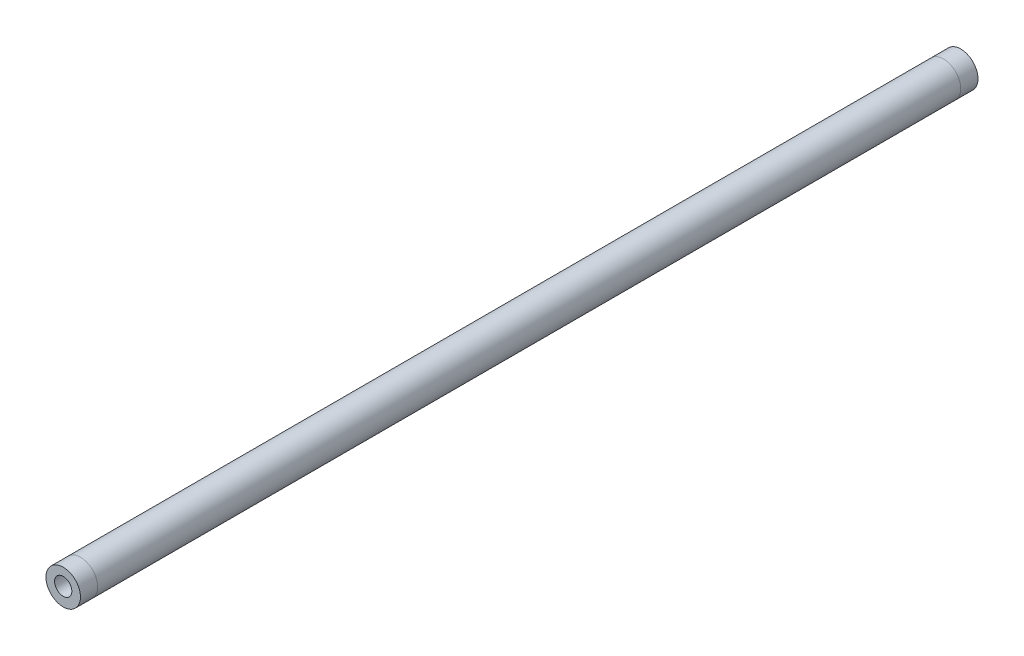
ISO-10303-21;
HEADER;
FILE_DESCRIPTION(('STEP AP214'),'2;1');
FILE_NAME('part.step','',(''),(''),'','','');
FILE_SCHEMA(('AUTOMOTIVE_DESIGN { 1 0 10303 214 1 1 1 1 }'));
ENDSEC;
DATA;
#1=APPLICATION_CONTEXT('core data for automotive mechanical design processes');
#2=APPLICATION_PROTOCOL_DEFINITION('international standard','automotive_design',2000,#1);
#3=PRODUCT_CONTEXT('',#1,'mechanical');
#4=PRODUCT('Part','Part','',(#3));
#5=PRODUCT_RELATED_PRODUCT_CATEGORY('part','',(#4));
#6=PRODUCT_DEFINITION_FORMATION('','',#4);
#7=PRODUCT_DEFINITION_CONTEXT('part definition',#1,'design');
#8=PRODUCT_DEFINITION('design','',#6,#7);
#9=PRODUCT_DEFINITION_SHAPE('','',#8);
#10=(LENGTH_UNIT() NAMED_UNIT(*) SI_UNIT(.MILLI.,.METRE.));
#11=(NAMED_UNIT(*) PLANE_ANGLE_UNIT() SI_UNIT($,.RADIAN.));
#12=(NAMED_UNIT(*) SI_UNIT($,.STERADIAN.) SOLID_ANGLE_UNIT());
#13=UNCERTAINTY_MEASURE_WITH_UNIT(LENGTH_MEASURE(1.E-05),#10,'distance_accuracy_value','');
#14=(GEOMETRIC_REPRESENTATION_CONTEXT(3) GLOBAL_UNCERTAINTY_ASSIGNED_CONTEXT((#13)) GLOBAL_UNIT_ASSIGNED_CONTEXT((#10,
#11,#12)) REPRESENTATION_CONTEXT('',''));
#15=CARTESIAN_POINT('',(0.,0.,0.));
#16=DIRECTION('',(0.,0.,1.));
#17=DIRECTION('',(1.,0.,0.));
#18=AXIS2_PLACEMENT_3D('',#15,#16,#17);
#19=CARTESIAN_POINT('',(0.,0.,-363.897823856573));
#20=DIRECTION('',(0.,0.,1.));
#21=DIRECTION('',(1.,0.,0.));
#22=AXIS2_PLACEMENT_3D('',#19,#20,#21);
#23=CYLINDRICAL_SURFACE('',#22,6.35);
#24=CARTESIAN_POINT('',(0.,0.,-345.937311614435));
#25=DIRECTION('',(0.,0.,1.));
#26=DIRECTION('',(1.,0.,0.));
#27=AXIS2_PLACEMENT_3D('',#24,#25,#26);
#28=CIRCLE('',#27,6.35);
#29=CARTESIAN_POINT('',(6.35,0.,-345.937311614435));
#30=VERTEX_POINT('',#29);
#31=EDGE_CURVE('E12',#30,#30,#28,.F.);
#32=ORIENTED_EDGE('',*,*,#31,.F.);
#33=EDGE_LOOP('',(#32));
#34=FACE_BOUND('',#33,.T.);
#35=CARTESIAN_POINT('',(0.,0.,-28.2448));
#36=DIRECTION('',(0.,0.,1.));
#37=DIRECTION('',(1.,0.,0.));
#38=AXIS2_PLACEMENT_3D('',#35,#36,#37);
#39=CIRCLE('',#38,6.35);
#40=CARTESIAN_POINT('',(6.35,0.,-28.2448));
#41=VERTEX_POINT('',#40);
#42=EDGE_CURVE('E79',#41,#41,#39,.T.);
#43=ORIENTED_EDGE('',*,*,#42,.F.);
#44=EDGE_LOOP('',(#43));
#45=FACE_BOUND('',#44,.T.);
#46=ADVANCED_FACE('F68',(#34,#45),#23,.T.);
#47=CARTESIAN_POINT('',(0.,0.,-28.2448));
#48=DIRECTION('',(0.,0.,1.));
#49=DIRECTION('',(1.,0.,0.));
#50=AXIS2_PLACEMENT_3D('',#47,#48,#49);
#51=PLANE('',#50);
#52=CARTESIAN_POINT('',(0.,0.,-28.2448));
#53=DIRECTION('',(0.,0.,1.));
#54=DIRECTION('',(1.,0.,0.));
#55=AXIS2_PLACEMENT_3D('',#52,#53,#54);
#56=CIRCLE('',#55,4.7625);
#57=CARTESIAN_POINT('',(4.7625,0.,-28.2448));
#58=VERTEX_POINT('',#57);
#59=EDGE_CURVE('E81',#58,#58,#56,.T.);
#60=ORIENTED_EDGE('',*,*,#59,.F.);
#61=EDGE_LOOP('',(#60));
#62=FACE_BOUND('',#61,.T.);
#63=ORIENTED_EDGE('',*,*,#42,.T.);
#64=EDGE_LOOP('',(#63));
#65=FACE_BOUND('',#64,.T.);
#66=ADVANCED_FACE('F86',(#62,#65),#51,.T.);
#67=CARTESIAN_POINT('',(0.,0.,-363.897823856573));
#68=DIRECTION('',(0.,0.,1.));
#69=DIRECTION('',(1.,0.,0.));
#70=AXIS2_PLACEMENT_3D('',#67,#68,#69);
#71=CYLINDRICAL_SURFACE('',#70,4.7625);
#72=CARTESIAN_POINT('',(0.,0.,-345.937311614435));
#73=DIRECTION('',(0.,0.,1.));
#74=DIRECTION('',(1.,0.,0.));
#75=AXIS2_PLACEMENT_3D('',#72,#73,#74);
#76=CIRCLE('',#75,4.7625);
#77=CARTESIAN_POINT('',(4.7625,0.,-345.937311614435));
#78=VERTEX_POINT('',#77);
#79=EDGE_CURVE('E71',#78,#78,#76,.F.);
#80=ORIENTED_EDGE('',*,*,#79,.T.);
#81=EDGE_LOOP('',(#80));
#82=FACE_BOUND('',#81,.T.);
#83=ORIENTED_EDGE('',*,*,#59,.T.);
#84=EDGE_LOOP('',(#83));
#85=FACE_BOUND('',#84,.T.);
#86=ADVANCED_FACE('F93',(#82,#85),#71,.F.);
#87=CARTESIAN_POINT('',(0.,0.,-345.937311614435));
#88=DIRECTION('',(0.,0.,1.));
#89=DIRECTION('',(1.,0.,0.));
#90=AXIS2_PLACEMENT_3D('',#87,#88,#89);
#91=PLANE('',#90);
#92=ORIENTED_EDGE('',*,*,#31,.T.);
#93=EDGE_LOOP('',(#92));
#94=FACE_BOUND('',#93,.T.);
#95=ORIENTED_EDGE('',*,*,#79,.F.);
#96=EDGE_LOOP('',(#95));
#97=FACE_BOUND('',#96,.T.);
#98=ADVANCED_FACE('F98',(#94,#97),#91,.F.);
#99=CLOSED_SHELL('',(#46,#66,#86,#98));
#100=MANIFOLD_SOLID_BREP('B2',#99);
#101=CARTESIAN_POINT('',(0.,0.,-345.937311614435));
#102=DIRECTION('',(0.,0.,1.));
#103=DIRECTION('',(1.,0.,0.));
#104=AXIS2_PLACEMENT_3D('',#101,#102,#103);
#105=PLANE('',#104);
#106=CARTESIAN_POINT('',(0.,0.,-345.937311614435));
#107=DIRECTION('',(0.,0.,1.));
#108=DIRECTION('',(1.,0.,0.));
#109=AXIS2_PLACEMENT_3D('',#106,#107,#108);
#110=CIRCLE('',#109,6.35);
#111=CARTESIAN_POINT('',(6.35,0.,-345.937311614435));
#112=VERTEX_POINT('',#111);
#113=EDGE_CURVE('E67',#112,#112,#110,.T.);
#114=ORIENTED_EDGE('',*,*,#113,.T.);
#115=EDGE_LOOP('',(#114));
#116=FACE_BOUND('',#115,.T.);
#117=CARTESIAN_POINT('',(0.,0.,-345.937311614435));
#118=DIRECTION('',(0.,0.,1.));
#119=DIRECTION('',(1.,0.,0.));
#120=AXIS2_PLACEMENT_3D('',#117,#118,#119);
#121=CIRCLE('',#120,4.7625);
#122=CARTESIAN_POINT('',(-4.7625,0.,-345.937311614435));
#123=VERTEX_POINT('',#122);
#124=EDGE_CURVE('E151',#123,#123,#121,.T.);
#125=ORIENTED_EDGE('',*,*,#124,.F.);
#126=EDGE_LOOP('',(#125));
#127=FACE_BOUND('',#126,.T.);
#128=ADVANCED_FACE('F137',(#116,#127),#105,.T.);
#129=CARTESIAN_POINT('',(0.,0.,-345.937311614435));
#130=DIRECTION('',(0.,0.,-1.));
#131=DIRECTION('',(-1.,0.,0.));
#132=AXIS2_PLACEMENT_3D('',#129,#130,#131);
#133=CYLINDRICAL_SURFACE('',#132,6.35);
#134=ORIENTED_EDGE('',*,*,#113,.F.);
#135=EDGE_LOOP('',(#134));
#136=FACE_BOUND('',#135,.T.);
#137=CARTESIAN_POINT('',(0.,0.,-352.287311614435));
#138=DIRECTION('',(0.,0.,1.));
#139=DIRECTION('',(1.,0.,0.));
#140=AXIS2_PLACEMENT_3D('',#137,#138,#139);
#141=CIRCLE('',#140,6.35);
#142=CARTESIAN_POINT('',(6.35,0.,-352.287311614435));
#143=VERTEX_POINT('',#142);
#144=EDGE_CURVE('E149',#143,#143,#141,.T.);
#145=ORIENTED_EDGE('',*,*,#144,.T.);
#146=EDGE_LOOP('',(#145));
#147=FACE_BOUND('',#146,.T.);
#148=ADVANCED_FACE('F139',(#136,#147),#133,.T.);
#149=CARTESIAN_POINT('',(0.,0.235008438761634,-345.937311614435));
#150=DIRECTION('',(0.,0.,-1.));
#151=DIRECTION('',(-1.,0.,0.));
#152=AXIS2_PLACEMENT_3D('',#149,#150,#151);
#153=CYLINDRICAL_SURFACE('',#152,3.175);
#154=CARTESIAN_POINT('',(0.,0.235008438761634,-352.287311614435));
#155=DIRECTION('',(0.,0.,1.));
#156=DIRECTION('',(1.,0.,0.));
#157=AXIS2_PLACEMENT_3D('',#154,#155,#156);
#158=CIRCLE('',#157,3.175);
#159=CARTESIAN_POINT('',(3.175,0.235008438761634,-352.287311614435));
#160=VERTEX_POINT('',#159);
#161=EDGE_CURVE('E141',#160,#160,#158,.T.);
#162=ORIENTED_EDGE('',*,*,#161,.F.);
#163=EDGE_LOOP('',(#162));
#164=FACE_BOUND('',#163,.T.);
#165=CARTESIAN_POINT('',(0.,0.235008438761634,-336.412311614435));
#166=DIRECTION('',(0.,0.,1.));
#167=DIRECTION('',(1.,0.,0.));
#168=AXIS2_PLACEMENT_3D('',#165,#166,#167);
#169=CIRCLE('',#168,3.175);
#170=CARTESIAN_POINT('',(3.175,0.235008438761634,-336.412311614435));
#171=VERTEX_POINT('',#170);
#172=EDGE_CURVE('E161',#171,#171,#169,.T.);
#173=ORIENTED_EDGE('',*,*,#172,.T.);
#174=EDGE_LOOP('',(#173));
#175=FACE_BOUND('',#174,.T.);
#176=ADVANCED_FACE('F166',(#164,#175),#153,.F.);
#177=CARTESIAN_POINT('',(0.,0.,-352.287311614435));
#178=DIRECTION('',(0.,0.,1.));
#179=DIRECTION('',(1.,0.,0.));
#180=AXIS2_PLACEMENT_3D('',#177,#178,#179);
#181=PLANE('',#180);
#182=ORIENTED_EDGE('',*,*,#144,.F.);
#183=EDGE_LOOP('',(#182));
#184=FACE_BOUND('',#183,.T.);
#185=ORIENTED_EDGE('',*,*,#161,.T.);
#186=EDGE_LOOP('',(#185));
#187=FACE_BOUND('',#186,.T.);
#188=ADVANCED_FACE('F171',(#184,#187),#181,.F.);
#189=CARTESIAN_POINT('',(0.,0.,-336.412311614435));
#190=DIRECTION('',(0.,0.,1.));
#191=DIRECTION('',(1.,0.,0.));
#192=AXIS2_PLACEMENT_3D('',#189,#190,#191);
#193=PLANE('',#192);
#194=CARTESIAN_POINT('',(0.,0.,-336.412311614435));
#195=DIRECTION('',(0.,0.,1.));
#196=DIRECTION('',(1.,0.,0.));
#197=AXIS2_PLACEMENT_3D('',#194,#195,#196);
#198=CIRCLE('',#197,4.7625);
#199=CARTESIAN_POINT('',(-4.7625,0.,-336.412311614435));
#200=VERTEX_POINT('',#199);
#201=EDGE_CURVE('E154',#200,#200,#198,.T.);
#202=ORIENTED_EDGE('',*,*,#201,.T.);
#203=EDGE_LOOP('',(#202));
#204=FACE_BOUND('',#203,.T.);
#205=ORIENTED_EDGE('',*,*,#172,.F.);
#206=EDGE_LOOP('',(#205));
#207=FACE_BOUND('',#206,.T.);
#208=ADVANCED_FACE('F168',(#204,#207),#193,.T.);
#209=CARTESIAN_POINT('',(0.,0.,-336.412311614435));
#210=DIRECTION('',(0.,0.,-1.));
#211=DIRECTION('',(-1.,0.,0.));
#212=AXIS2_PLACEMENT_3D('',#209,#210,#211);
#213=CYLINDRICAL_SURFACE('',#212,4.7625);
#214=CARTESIAN_POINT('',(-4.7625,0.,-336.412311614435));
#215=CARTESIAN_POINT('',(-4.7625,0.,-336.511530364435));
#216=CARTESIAN_POINT('',(-4.7625,0.,-336.610749114435));
#217=CARTESIAN_POINT('',(-4.7625,0.,-336.809186614435));
#218=CARTESIAN_POINT('',(-4.7625,0.,-336.908405364435));
#219=CARTESIAN_POINT('',(-4.7625,0.,-337.106842864435));
#220=CARTESIAN_POINT('',(-4.7625,0.,-337.206061614435));
#221=CARTESIAN_POINT('',(-4.7625,0.,-337.404499114435));
#222=CARTESIAN_POINT('',(-4.7625,0.,-337.503717864435));
#223=CARTESIAN_POINT('',(-4.7625,0.,-337.702155364435));
#224=CARTESIAN_POINT('',(-4.7625,0.,-337.801374114435));
#225=CARTESIAN_POINT('',(-4.7625,0.,-337.999811614435));
#226=CARTESIAN_POINT('',(-4.7625,0.,-338.099030364435));
#227=CARTESIAN_POINT('',(-4.7625,0.,-338.297467864435));
#228=CARTESIAN_POINT('',(-4.7625,0.,-338.396686614435));
#229=CARTESIAN_POINT('',(-4.7625,0.,-338.595124114435));
#230=CARTESIAN_POINT('',(-4.7625,0.,-338.694342864435));
#231=CARTESIAN_POINT('',(-4.7625,0.,-338.892780364435));
#232=CARTESIAN_POINT('',(-4.7625,0.,-338.991999114435));
#233=CARTESIAN_POINT('',(-4.7625,0.,-339.190436614435));
#234=CARTESIAN_POINT('',(-4.7625,0.,-339.289655364435));
#235=CARTESIAN_POINT('',(-4.7625,0.,-339.488092864435));
#236=CARTESIAN_POINT('',(-4.7625,0.,-339.587311614435));
#237=CARTESIAN_POINT('',(-4.7625,0.,-339.785749114435));
#238=CARTESIAN_POINT('',(-4.7625,0.,-339.884967864435));
#239=CARTESIAN_POINT('',(-4.7625,0.,-340.083405364435));
#240=CARTESIAN_POINT('',(-4.7625,0.,-340.182624114435));
#241=CARTESIAN_POINT('',(-4.7625,0.,-340.381061614435));
#242=CARTESIAN_POINT('',(-4.7625,0.,-340.480280364435));
#243=CARTESIAN_POINT('',(-4.7625,0.,-340.678717864435));
#244=CARTESIAN_POINT('',(-4.7625,0.,-340.777936614435));
#245=CARTESIAN_POINT('',(-4.7625,0.,-340.976374114435));
#246=CARTESIAN_POINT('',(-4.7625,0.,-341.075592864435));
#247=CARTESIAN_POINT('',(-4.7625,0.,-341.274030364435));
#248=CARTESIAN_POINT('',(-4.7625,0.,-341.373249114435));
#249=CARTESIAN_POINT('',(-4.7625,0.,-341.571686614435));
#250=CARTESIAN_POINT('',(-4.7625,0.,-341.670905364435));
#251=CARTESIAN_POINT('',(-4.7625,0.,-341.869342864435));
#252=CARTESIAN_POINT('',(-4.7625,0.,-341.968561614435));
#253=CARTESIAN_POINT('',(-4.7625,0.,-342.166999114435));
#254=CARTESIAN_POINT('',(-4.7625,0.,-342.266217864435));
#255=CARTESIAN_POINT('',(-4.7625,0.,-342.464655364435));
#256=CARTESIAN_POINT('',(-4.7625,0.,-342.563874114435));
#257=CARTESIAN_POINT('',(-4.7625,0.,-342.762311614435));
#258=CARTESIAN_POINT('',(-4.7625,0.,-342.861530364435));
#259=CARTESIAN_POINT('',(-4.7625,0.,-343.059967864435));
#260=CARTESIAN_POINT('',(-4.7625,0.,-343.159186614435));
#261=CARTESIAN_POINT('',(-4.7625,0.,-343.357624114435));
#262=CARTESIAN_POINT('',(-4.7625,0.,-343.456842864435));
#263=CARTESIAN_POINT('',(-4.7625,0.,-343.655280364435));
#264=CARTESIAN_POINT('',(-4.7625,0.,-343.754499114435));
#265=CARTESIAN_POINT('',(-4.7625,0.,-343.952936614435));
#266=CARTESIAN_POINT('',(-4.7625,0.,-344.052155364435));
#267=CARTESIAN_POINT('',(-4.7625,0.,-344.250592864435));
#268=CARTESIAN_POINT('',(-4.7625,0.,-344.349811614435));
#269=CARTESIAN_POINT('',(-4.7625,0.,-344.548249114435));
#270=CARTESIAN_POINT('',(-4.7625,0.,-344.647467864435));
#271=CARTESIAN_POINT('',(-4.7625,0.,-344.845905364435));
#272=CARTESIAN_POINT('',(-4.7625,0.,-344.945124114435));
#273=CARTESIAN_POINT('',(-4.7625,0.,-345.143561614435));
#274=CARTESIAN_POINT('',(-4.7625,0.,-345.242780364435));
#275=CARTESIAN_POINT('',(-4.7625,0.,-345.441217864435));
#276=CARTESIAN_POINT('',(-4.7625,0.,-345.540436614435));
#277=CARTESIAN_POINT('',(-4.7625,0.,-345.738874114435));
#278=CARTESIAN_POINT('',(-4.7625,0.,-345.838092864435));
#279=CARTESIAN_POINT('',(-4.7625,0.,-345.937311614435));
#280=B_SPLINE_CURVE_WITH_KNOTS('',3,(#214,#215,#216,#217,#218,#219,#220,#221,#222,#223,#224,
#225,#226,#227,#228,#229,#230,#231,#232,#233,#234,#235,#236,#237,#238,#239,#240,#241,#242,#243,
#244,#245,#246,#247,#248,#249,#250,#251,#252,#253,#254,#255,#256,#257,#258,#259,#260,#261,#262,
#263,#264,#265,#266,#267,#268,#269,#270,#271,#272,#273,#274,#275,#276,#277,#278,#279),
.UNSPECIFIED.,.F.,.F.,(4,2,2,2,2,2,2,2,2,2,2,2,2,2,2,2,2,2,2,2,2,2,2,2,2,2,2,2,2,2,2,2,4),(0.,
0.29765625,0.5953125,0.892968750000001,1.190625,1.48828125,1.7859375,2.08359375,2.38125,
2.67890625,2.9765625,3.27421875,3.571875,3.86953125,4.1671875,4.46484375,4.7625,5.06015625,
5.3578125,5.65546875,5.953125,6.25078125,6.5484375,6.84609375,7.14375,7.44140625,7.7390625,
8.03671875000001,8.334375,8.63203125,8.92968750000001,9.22734375000001,9.52500000000001),.UNSPECIFIED.);
#281=EDGE_CURVE('BSEAM170',#200,#123,#280,.T.);
#282=ORIENTED_EDGE('',*,*,#201,.F.);
#283=ORIENTED_EDGE('',*,*,#124,.T.);
#284=ORIENTED_EDGE('',*,*,#281,.T.);
#285=ORIENTED_EDGE('',*,*,#281,.F.);
#286=EDGE_LOOP('',(#282,#284,#283,#285));
#287=FACE_BOUND('',#286,.T.);
#288=ADVANCED_FACE('F170',(#287),#213,.T.);
#289=CLOSED_SHELL('',(#128,#148,#176,#188,#208,#288));
#290=MANIFOLD_SOLID_BREP('B7',#289);
#291=CARTESIAN_POINT('',(0.,0.,-28.2448));
#292=DIRECTION('',(0.,0.,1.));
#293=DIRECTION('',(1.,0.,0.));
#294=AXIS2_PLACEMENT_3D('',#291,#292,#293);
#295=CYLINDRICAL_SURFACE('',#294,6.35);
#296=CARTESIAN_POINT('',(0.,0.,-28.2448));
#297=DIRECTION('',(0.,0.,1.));
#298=DIRECTION('',(1.,0.,0.));
#299=AXIS2_PLACEMENT_3D('',#296,#297,#298);
#300=CIRCLE('',#299,6.35);
#301=CARTESIAN_POINT('',(6.35,0.,-28.2448));
#302=VERTEX_POINT('',#301);
#303=EDGE_CURVE('E136',#302,#302,#300,.T.);
#304=ORIENTED_EDGE('',*,*,#303,.T.);
#305=EDGE_LOOP('',(#304));
#306=FACE_BOUND('',#305,.T.);
#307=CARTESIAN_POINT('',(0.,0.,-21.8948));
#308=DIRECTION('',(0.,0.,1.));
#309=DIRECTION('',(1.,0.,0.));
#310=AXIS2_PLACEMENT_3D('',#307,#308,#309);
#311=CIRCLE('',#310,6.35);
#312=CARTESIAN_POINT('',(6.35,0.,-21.8948));
#313=VERTEX_POINT('',#312);
#314=EDGE_CURVE('E249',#313,#313,#311,.T.);
#315=ORIENTED_EDGE('',*,*,#314,.F.);
#316=EDGE_LOOP('',(#315));
#317=FACE_BOUND('',#316,.T.);
#318=ADVANCED_FACE('F238',(#306,#317),#295,.T.);
#319=CARTESIAN_POINT('',(0.,0.235008438761634,-28.2448));
#320=DIRECTION('',(0.,0.,1.));
#321=DIRECTION('',(1.,0.,0.));
#322=AXIS2_PLACEMENT_3D('',#319,#320,#321);
#323=CYLINDRICAL_SURFACE('',#322,3.175);
#324=CARTESIAN_POINT('',(0.,0.235008438761634,-21.8948));
#325=DIRECTION('',(0.,0.,1.));
#326=DIRECTION('',(1.,0.,0.));
#327=AXIS2_PLACEMENT_3D('',#324,#325,#326);
#328=CIRCLE('',#327,3.175);
#329=CARTESIAN_POINT('',(3.175,0.235008438761634,-21.8948));
#330=VERTEX_POINT('',#329);
#331=EDGE_CURVE('E241',#330,#330,#328,.T.);
#332=ORIENTED_EDGE('',*,*,#331,.T.);
#333=EDGE_LOOP('',(#332));
#334=FACE_BOUND('',#333,.T.);
#335=CARTESIAN_POINT('',(0.,0.235008438761634,-37.7698));
#336=DIRECTION('',(0.,0.,1.));
#337=DIRECTION('',(1.,0.,0.));
#338=AXIS2_PLACEMENT_3D('',#335,#336,#337);
#339=CIRCLE('',#338,3.175);
#340=CARTESIAN_POINT('',(3.175,0.235008438761634,-37.7698));
#341=VERTEX_POINT('',#340);
#342=EDGE_CURVE('E261',#341,#341,#339,.T.);
#343=ORIENTED_EDGE('',*,*,#342,.F.);
#344=EDGE_LOOP('',(#343));
#345=FACE_BOUND('',#344,.T.);
#346=ADVANCED_FACE('F269',(#334,#345),#323,.F.);
#347=CARTESIAN_POINT('',(0.,0.,-28.2448));
#348=DIRECTION('',(0.,0.,1.));
#349=DIRECTION('',(1.,0.,0.));
#350=AXIS2_PLACEMENT_3D('',#347,#348,#349);
#351=PLANE('',#350);
#352=CARTESIAN_POINT('',(0.,0.,-28.2448));
#353=DIRECTION('',(0.,0.,1.));
#354=DIRECTION('',(1.,0.,0.));
#355=AXIS2_PLACEMENT_3D('',#352,#353,#354);
#356=CIRCLE('',#355,4.7625);
#357=CARTESIAN_POINT('',(4.7625,0.,-28.2448));
#358=VERTEX_POINT('',#357);
#359=EDGE_CURVE('E251',#358,#358,#356,.T.);
#360=ORIENTED_EDGE('',*,*,#359,.T.);
#361=EDGE_LOOP('',(#360));
#362=FACE_BOUND('',#361,.T.);
#363=ORIENTED_EDGE('',*,*,#303,.F.);
#364=EDGE_LOOP('',(#363));
#365=FACE_BOUND('',#364,.T.);
#366=ADVANCED_FACE('F271',(#362,#365),#351,.F.);
#367=CARTESIAN_POINT('',(0.,0.,-21.8948));
#368=DIRECTION('',(0.,0.,1.));
#369=DIRECTION('',(1.,0.,0.));
#370=AXIS2_PLACEMENT_3D('',#367,#368,#369);
#371=PLANE('',#370);
#372=ORIENTED_EDGE('',*,*,#314,.T.);
#373=EDGE_LOOP('',(#372));
#374=FACE_BOUND('',#373,.T.);
#375=ORIENTED_EDGE('',*,*,#331,.F.);
#376=EDGE_LOOP('',(#375));
#377=FACE_BOUND('',#376,.T.);
#378=ADVANCED_FACE('F277',(#374,#377),#371,.T.);
#379=CARTESIAN_POINT('',(0.,0.,-37.7698));
#380=DIRECTION('',(0.,0.,1.));
#381=DIRECTION('',(1.,0.,0.));
#382=AXIS2_PLACEMENT_3D('',#379,#380,#381);
#383=CYLINDRICAL_SURFACE('',#382,4.7625);
#384=CARTESIAN_POINT('',(0.,0.,-37.7698));
#385=DIRECTION('',(0.,0.,1.));
#386=DIRECTION('',(1.,0.,0.));
#387=AXIS2_PLACEMENT_3D('',#384,#385,#386);
#388=CIRCLE('',#387,4.7625);
#389=CARTESIAN_POINT('',(4.7625,0.,-37.7698));
#390=VERTEX_POINT('',#389);
#391=EDGE_CURVE('E254',#390,#390,#388,.T.);
#392=CARTESIAN_POINT('',(4.7625,0.,-37.7698));
#393=CARTESIAN_POINT('',(4.7625,0.,-37.67058125));
#394=CARTESIAN_POINT('',(4.7625,0.,-37.5713625));
#395=CARTESIAN_POINT('',(4.7625,0.,-37.372925));
#396=CARTESIAN_POINT('',(4.7625,0.,-37.27370625));
#397=CARTESIAN_POINT('',(4.7625,0.,-37.07526875));
#398=CARTESIAN_POINT('',(4.7625,0.,-36.97605));
#399=CARTESIAN_POINT('',(4.7625,0.,-36.7776125));
#400=CARTESIAN_POINT('',(4.7625,0.,-36.67839375));
#401=CARTESIAN_POINT('',(4.7625,0.,-36.47995625));
#402=CARTESIAN_POINT('',(4.7625,0.,-36.3807375));
#403=CARTESIAN_POINT('',(4.7625,0.,-36.1823));
#404=CARTESIAN_POINT('',(4.7625,0.,-36.08308125));
#405=CARTESIAN_POINT('',(4.7625,0.,-35.88464375));
#406=CARTESIAN_POINT('',(4.7625,0.,-35.785425));
#407=CARTESIAN_POINT('',(4.7625,0.,-35.5869875));
#408=CARTESIAN_POINT('',(4.7625,0.,-35.48776875));
#409=CARTESIAN_POINT('',(4.7625,0.,-35.28933125));
#410=CARTESIAN_POINT('',(4.7625,0.,-35.1901125));
#411=CARTESIAN_POINT('',(4.7625,0.,-34.991675));
#412=CARTESIAN_POINT('',(4.7625,0.,-34.89245625));
#413=CARTESIAN_POINT('',(4.7625,0.,-34.69401875));
#414=CARTESIAN_POINT('',(4.7625,0.,-34.5948));
#415=CARTESIAN_POINT('',(4.7625,0.,-34.3963625));
#416=CARTESIAN_POINT('',(4.7625,0.,-34.29714375));
#417=CARTESIAN_POINT('',(4.7625,0.,-34.09870625));
#418=CARTESIAN_POINT('',(4.7625,0.,-33.9994875));
#419=CARTESIAN_POINT('',(4.7625,0.,-33.80105));
#420=CARTESIAN_POINT('',(4.7625,0.,-33.70183125));
#421=CARTESIAN_POINT('',(4.7625,0.,-33.50339375));
#422=CARTESIAN_POINT('',(4.7625,0.,-33.404175));
#423=CARTESIAN_POINT('',(4.7625,0.,-33.2057375));
#424=CARTESIAN_POINT('',(4.7625,0.,-33.10651875));
#425=CARTESIAN_POINT('',(4.7625,0.,-32.90808125));
#426=CARTESIAN_POINT('',(4.7625,0.,-32.8088625));
#427=CARTESIAN_POINT('',(4.7625,0.,-32.610425));
#428=CARTESIAN_POINT('',(4.7625,0.,-32.51120625));
#429=CARTESIAN_POINT('',(4.7625,0.,-32.31276875));
#430=CARTESIAN_POINT('',(4.7625,0.,-32.21355));
#431=CARTESIAN_POINT('',(4.7625,0.,-32.0151125));
#432=CARTESIAN_POINT('',(4.7625,0.,-31.91589375));
#433=CARTESIAN_POINT('',(4.7625,0.,-31.71745625));
#434=CARTESIAN_POINT('',(4.7625,0.,-31.6182375));
#435=CARTESIAN_POINT('',(4.7625,0.,-31.4198));
#436=CARTESIAN_POINT('',(4.7625,0.,-31.32058125));
#437=CARTESIAN_POINT('',(4.7625,0.,-31.12214375));
#438=CARTESIAN_POINT('',(4.7625,0.,-31.022925));
#439=CARTESIAN_POINT('',(4.7625,0.,-30.8244875));
#440=CARTESIAN_POINT('',(4.7625,0.,-30.72526875));
#441=CARTESIAN_POINT('',(4.7625,0.,-30.52683125));
#442=CARTESIAN_POINT('',(4.7625,0.,-30.4276125));
#443=CARTESIAN_POINT('',(4.7625,0.,-30.229175));
#444=CARTESIAN_POINT('',(4.7625,0.,-30.12995625));
#445=CARTESIAN_POINT('',(4.7625,0.,-29.93151875));
#446=CARTESIAN_POINT('',(4.7625,0.,-29.8323));
#447=CARTESIAN_POINT('',(4.7625,0.,-29.6338625));
#448=CARTESIAN_POINT('',(4.7625,0.,-29.53464375));
#449=CARTESIAN_POINT('',(4.7625,0.,-29.33620625));
#450=CARTESIAN_POINT('',(4.7625,0.,-29.2369875));
#451=CARTESIAN_POINT('',(4.7625,0.,-29.03855));
#452=CARTESIAN_POINT('',(4.7625,0.,-28.93933125));
#453=CARTESIAN_POINT('',(4.7625,0.,-28.74089375));
#454=CARTESIAN_POINT('',(4.7625,0.,-28.641675));
#455=CARTESIAN_POINT('',(4.7625,0.,-28.4432375));
#456=CARTESIAN_POINT('',(4.7625,0.,-28.34401875));
#457=CARTESIAN_POINT('',(4.7625,0.,-28.2448));
#458=B_SPLINE_CURVE_WITH_KNOTS('',3,(#392,#393,#394,#395,#396,#397,#398,#399,#400,#401,#402,
#403,#404,#405,#406,#407,#408,#409,#410,#411,#412,#413,#414,#415,#416,#417,#418,#419,#420,#421,
#422,#423,#424,#425,#426,#427,#428,#429,#430,#431,#432,#433,#434,#435,#436,#437,#438,#439,#440,
#441,#442,#443,#444,#445,#446,#447,#448,#449,#450,#451,#452,#453,#454,#455,#456,#457),
.UNSPECIFIED.,.F.,.F.,(4,2,2,2,2,2,2,2,2,2,2,2,2,2,2,2,2,2,2,2,2,2,2,2,2,2,2,2,2,2,2,2,4),(0.,
0.297656249999993,0.595312499999993,0.892968749999994,1.19062499999999,1.48828124999999,
1.78593749999999,2.08359374999999,2.38124999999999,2.67890624999999,2.97656249999999,
3.27421874999999,3.571875,3.86953125,4.1671875,4.46484375,4.7625,5.06015625,5.3578125,
5.65546875,5.953125,6.25078125,6.5484375,6.84609375,7.14375,7.44140625,7.7390625,8.03671875,
8.334375,8.63203125,8.9296875,9.22734375,9.525),.UNSPECIFIED.);
#459=EDGE_CURVE('BSEAM282',#390,#358,#458,.T.);
#460=ORIENTED_EDGE('',*,*,#391,.T.);
#461=ORIENTED_EDGE('',*,*,#359,.F.);
#462=ORIENTED_EDGE('',*,*,#459,.T.);
#463=ORIENTED_EDGE('',*,*,#459,.F.);
#464=EDGE_LOOP('',(#460,#462,#461,#463));
#465=FACE_BOUND('',#464,.T.);
#466=ADVANCED_FACE('F282',(#465),#383,.T.);
#467=CARTESIAN_POINT('',(0.,0.,-37.7698));
#468=DIRECTION('',(0.,0.,1.));
#469=DIRECTION('',(1.,0.,0.));
#470=AXIS2_PLACEMENT_3D('',#467,#468,#469);
#471=PLANE('',#470);
#472=ORIENTED_EDGE('',*,*,#342,.T.);
#473=EDGE_LOOP('',(#472));
#474=FACE_BOUND('',#473,.T.);
#475=ORIENTED_EDGE('',*,*,#391,.F.);
#476=EDGE_LOOP('',(#475));
#477=FACE_BOUND('',#476,.T.);
#478=ADVANCED_FACE('F266',(#474,#477),#471,.F.);
#479=CLOSED_SHELL('',(#318,#346,#366,#378,#466,#478));
#480=MANIFOLD_SOLID_BREP('B62',#479);
#481=ADVANCED_BREP_SHAPE_REPRESENTATION('',(#18,#100,#290,#480),#14);
#482=SHAPE_DEFINITION_REPRESENTATION(#9,#481);
ENDSEC;
END-ISO-10303-21;
